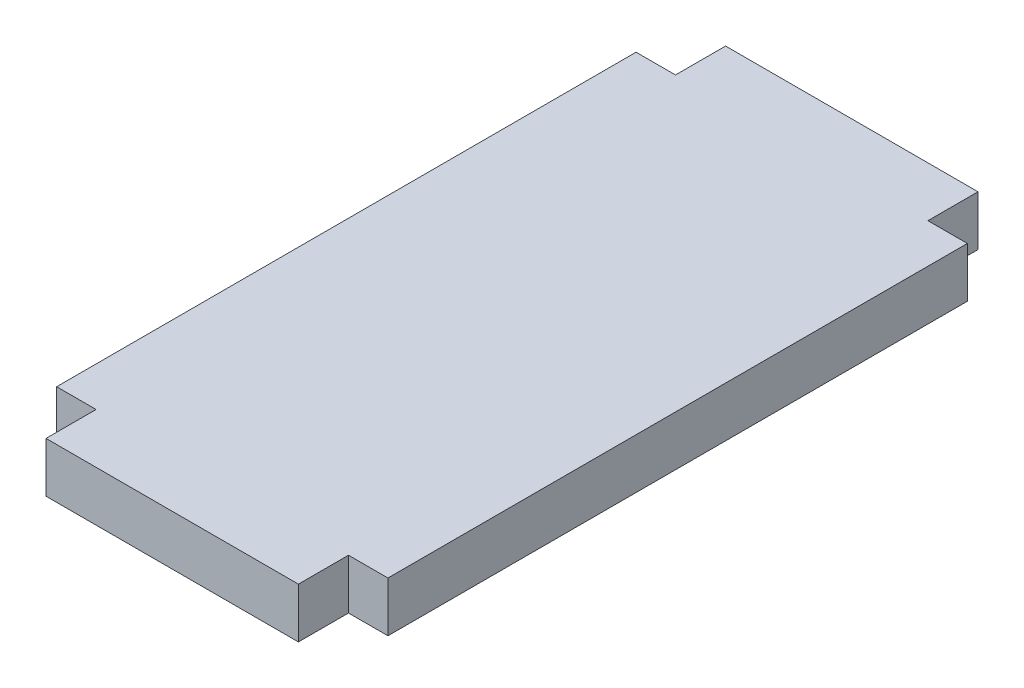
ISO-10303-21;
HEADER;
FILE_DESCRIPTION(('STEP AP214'),'2;1');
FILE_NAME('part.step','',(''),(''),'','','');
FILE_SCHEMA(('AUTOMOTIVE_DESIGN { 1 0 10303 214 1 1 1 1 }'));
ENDSEC;
DATA;
#1=APPLICATION_CONTEXT('core data for automotive mechanical design processes');
#2=APPLICATION_PROTOCOL_DEFINITION('international standard','automotive_design',2000,#1);
#3=PRODUCT_CONTEXT('',#1,'mechanical');
#4=PRODUCT('Part','Part','',(#3));
#5=PRODUCT_RELATED_PRODUCT_CATEGORY('part','',(#4));
#6=PRODUCT_DEFINITION_FORMATION('','',#4);
#7=PRODUCT_DEFINITION_CONTEXT('part definition',#1,'design');
#8=PRODUCT_DEFINITION('design','',#6,#7);
#9=PRODUCT_DEFINITION_SHAPE('','',#8);
#10=(LENGTH_UNIT() NAMED_UNIT(*) SI_UNIT(.MILLI.,.METRE.));
#11=(NAMED_UNIT(*) PLANE_ANGLE_UNIT() SI_UNIT($,.RADIAN.));
#12=(NAMED_UNIT(*) SI_UNIT($,.STERADIAN.) SOLID_ANGLE_UNIT());
#13=UNCERTAINTY_MEASURE_WITH_UNIT(LENGTH_MEASURE(1.E-05),#10,'distance_accuracy_value','');
#14=(GEOMETRIC_REPRESENTATION_CONTEXT(3) GLOBAL_UNCERTAINTY_ASSIGNED_CONTEXT((#13)) GLOBAL_UNIT_ASSIGNED_CONTEXT((#10,
#11,#12)) REPRESENTATION_CONTEXT('',''));
#15=CARTESIAN_POINT('',(0.,0.,0.));
#16=DIRECTION('',(0.,0.,1.));
#17=DIRECTION('',(1.,0.,0.));
#18=AXIS2_PLACEMENT_3D('',#15,#16,#17);
#19=CARTESIAN_POINT('',(0.,3.175,18.365));
#20=DIRECTION('',(0.,0.,-1.));
#21=DIRECTION('',(-1.,0.,0.));
#22=AXIS2_PLACEMENT_3D('',#19,#20,#21);
#23=PLANE('',#22);
#24=DIRECTION('',(1.,0.,0.));
#25=VECTOR('',#24,1.);
#26=CARTESIAN_POINT('',(0.,0.,18.365));
#27=LINE('',#26,#25);
#28=CARTESIAN_POINT('',(-10.5,0.,18.365));
#29=VERTEX_POINT('',#28);
#30=CARTESIAN_POINT('',(-8.,0.,18.365));
#31=VERTEX_POINT('',#30);
#32=EDGE_CURVE('E154',#29,#31,#27,.T.);
#33=ORIENTED_EDGE('',*,*,#32,.T.);
#34=DIRECTION('',(0.,-1.,0.));
#35=VECTOR('',#34,1.);
#36=CARTESIAN_POINT('',(-8.,3.175,18.365));
#37=LINE('',#36,#35);
#38=CARTESIAN_POINT('',(-8.,3.175,18.365));
#39=VERTEX_POINT('',#38);
#40=EDGE_CURVE('E11',#39,#31,#37,.T.);
#41=ORIENTED_EDGE('',*,*,#40,.F.);
#42=DIRECTION('',(1.,0.,0.));
#43=VECTOR('',#42,1.);
#44=CARTESIAN_POINT('',(0.,3.175,18.365));
#45=LINE('',#44,#43);
#46=CARTESIAN_POINT('',(-10.5,3.175,18.365));
#47=VERTEX_POINT('',#46);
#48=EDGE_CURVE('E184',#47,#39,#45,.T.);
#49=ORIENTED_EDGE('',*,*,#48,.F.);
#50=DIRECTION('',(0.,-1.,0.));
#51=VECTOR('',#50,1.);
#52=CARTESIAN_POINT('',(-10.5,3.175,18.365));
#53=LINE('',#52,#51);
#54=EDGE_CURVE('E150',#47,#29,#53,.T.);
#55=ORIENTED_EDGE('',*,*,#54,.T.);
#56=EDGE_LOOP('',(#33,#41,#49,#55));
#57=FACE_BOUND('',#56,.T.);
#58=ADVANCED_FACE('F35',(#57),#23,.F.);
#59=CARTESIAN_POINT('',(-8.,3.175,0.));
#60=DIRECTION('',(1.,0.,0.));
#61=DIRECTION('',(0.,0.,-1.));
#62=AXIS2_PLACEMENT_3D('',#59,#60,#61);
#63=PLANE('',#62);
#64=DIRECTION('',(0.,0.,1.));
#65=VECTOR('',#64,1.);
#66=CARTESIAN_POINT('',(-8.,0.,0.));
#67=LINE('',#66,#65);
#68=CARTESIAN_POINT('',(-8.,0.,21.54));
#69=VERTEX_POINT('',#68);
#70=EDGE_CURVE('E157',#31,#69,#67,.T.);
#71=ORIENTED_EDGE('',*,*,#70,.T.);
#72=DIRECTION('',(0.,-1.,0.));
#73=VECTOR('',#72,1.);
#74=CARTESIAN_POINT('',(-8.,3.175,21.54));
#75=LINE('',#74,#73);
#76=CARTESIAN_POINT('',(-8.,3.175,21.54));
#77=VERTEX_POINT('',#76);
#78=EDGE_CURVE('E43',#77,#69,#75,.T.);
#79=ORIENTED_EDGE('',*,*,#78,.F.);
#80=DIRECTION('',(0.,0.,1.));
#81=VECTOR('',#80,1.);
#82=CARTESIAN_POINT('',(-8.,3.175,0.));
#83=LINE('',#82,#81);
#84=EDGE_CURVE('E102',#39,#77,#83,.T.);
#85=ORIENTED_EDGE('',*,*,#84,.F.);
#86=ORIENTED_EDGE('',*,*,#40,.T.);
#87=EDGE_LOOP('',(#71,#79,#85,#86));
#88=FACE_BOUND('',#87,.T.);
#89=ADVANCED_FACE('F249',(#88),#63,.F.);
#90=CARTESIAN_POINT('',(0.,3.175,21.54));
#91=DIRECTION('',(0.,0.,-1.));
#92=DIRECTION('',(-1.,0.,0.));
#93=AXIS2_PLACEMENT_3D('',#90,#91,#92);
#94=PLANE('',#93);
#95=DIRECTION('',(1.,0.,0.));
#96=VECTOR('',#95,1.);
#97=CARTESIAN_POINT('',(0.,0.,21.54));
#98=LINE('',#97,#96);
#99=CARTESIAN_POINT('',(8.,0.,21.54));
#100=VERTEX_POINT('',#99);
#101=EDGE_CURVE('E159',#69,#100,#98,.T.);
#102=ORIENTED_EDGE('',*,*,#101,.T.);
#103=DIRECTION('',(0.,-1.,0.));
#104=VECTOR('',#103,1.);
#105=CARTESIAN_POINT('',(8.,3.175,21.54));
#106=LINE('',#105,#104);
#107=CARTESIAN_POINT('',(8.,3.175,21.54));
#108=VERTEX_POINT('',#107);
#109=EDGE_CURVE('E198',#108,#100,#106,.T.);
#110=ORIENTED_EDGE('',*,*,#109,.F.);
#111=DIRECTION('',(1.,0.,0.));
#112=VECTOR('',#111,1.);
#113=CARTESIAN_POINT('',(0.,3.175,21.54));
#114=LINE('',#113,#112);
#115=EDGE_CURVE('E205',#77,#108,#114,.T.);
#116=ORIENTED_EDGE('',*,*,#115,.F.);
#117=ORIENTED_EDGE('',*,*,#78,.T.);
#118=EDGE_LOOP('',(#102,#110,#116,#117));
#119=FACE_BOUND('',#118,.T.);
#120=ADVANCED_FACE('F203',(#119),#94,.F.);
#121=CARTESIAN_POINT('',(8.,3.175,0.));
#122=DIRECTION('',(1.,0.,0.));
#123=DIRECTION('',(0.,0.,-1.));
#124=AXIS2_PLACEMENT_3D('',#121,#122,#123);
#125=PLANE('',#124);
#126=DIRECTION('',(0.,0.,1.));
#127=VECTOR('',#126,1.);
#128=CARTESIAN_POINT('',(8.,0.,0.));
#129=LINE('',#128,#127);
#130=CARTESIAN_POINT('',(8.,0.,18.365));
#131=VERTEX_POINT('',#130);
#132=EDGE_CURVE('E162',#131,#100,#129,.T.);
#133=ORIENTED_EDGE('',*,*,#132,.F.);
#134=DIRECTION('',(0.,-1.,0.));
#135=VECTOR('',#134,1.);
#136=CARTESIAN_POINT('',(8.,3.175,18.365));
#137=LINE('',#136,#135);
#138=CARTESIAN_POINT('',(8.,3.175,18.365));
#139=VERTEX_POINT('',#138);
#140=EDGE_CURVE('E196',#139,#131,#137,.T.);
#141=ORIENTED_EDGE('',*,*,#140,.F.);
#142=DIRECTION('',(0.,0.,1.));
#143=VECTOR('',#142,1.);
#144=CARTESIAN_POINT('',(8.,3.175,0.));
#145=LINE('',#144,#143);
#146=EDGE_CURVE('E216',#139,#108,#145,.T.);
#147=ORIENTED_EDGE('',*,*,#146,.T.);
#148=ORIENTED_EDGE('',*,*,#109,.T.);
#149=EDGE_LOOP('',(#133,#141,#147,#148));
#150=FACE_BOUND('',#149,.T.);
#151=ADVANCED_FACE('F212',(#150),#125,.T.);
#152=CARTESIAN_POINT('',(0.,3.175,18.365));
#153=DIRECTION('',(0.,0.,-1.));
#154=DIRECTION('',(-1.,0.,0.));
#155=AXIS2_PLACEMENT_3D('',#152,#153,#154);
#156=PLANE('',#155);
#157=DIRECTION('',(1.,0.,0.));
#158=VECTOR('',#157,1.);
#159=CARTESIAN_POINT('',(0.,0.,18.365));
#160=LINE('',#159,#158);
#161=CARTESIAN_POINT('',(10.5,0.,18.365));
#162=VERTEX_POINT('',#161);
#163=EDGE_CURVE('E165',#131,#162,#160,.T.);
#164=ORIENTED_EDGE('',*,*,#163,.T.);
#165=DIRECTION('',(0.,-1.,0.));
#166=VECTOR('',#165,1.);
#167=CARTESIAN_POINT('',(10.5,3.175,18.365));
#168=LINE('',#167,#166);
#169=CARTESIAN_POINT('',(10.5,3.175,18.365));
#170=VERTEX_POINT('',#169);
#171=EDGE_CURVE('E194',#170,#162,#168,.T.);
#172=ORIENTED_EDGE('',*,*,#171,.F.);
#173=DIRECTION('',(1.,0.,0.));
#174=VECTOR('',#173,1.);
#175=CARTESIAN_POINT('',(0.,3.175,18.365));
#176=LINE('',#175,#174);
#177=EDGE_CURVE('E217',#139,#170,#176,.T.);
#178=ORIENTED_EDGE('',*,*,#177,.F.);
#179=ORIENTED_EDGE('',*,*,#140,.T.);
#180=EDGE_LOOP('',(#164,#172,#178,#179));
#181=FACE_BOUND('',#180,.T.);
#182=ADVANCED_FACE('F260',(#181),#156,.F.);
#183=CARTESIAN_POINT('',(10.5,3.175,0.));
#184=DIRECTION('',(1.,0.,0.));
#185=DIRECTION('',(0.,0.,-1.));
#186=AXIS2_PLACEMENT_3D('',#183,#184,#185);
#187=PLANE('',#186);
#188=DIRECTION('',(0.,0.,1.));
#189=VECTOR('',#188,1.);
#190=CARTESIAN_POINT('',(10.5,0.,0.));
#191=LINE('',#190,#189);
#192=CARTESIAN_POINT('',(10.5,0.,-18.365));
#193=VERTEX_POINT('',#192);
#194=EDGE_CURVE('E168',#193,#162,#191,.T.);
#195=ORIENTED_EDGE('',*,*,#194,.F.);
#196=DIRECTION('',(0.,-1.,0.));
#197=VECTOR('',#196,1.);
#198=CARTESIAN_POINT('',(10.5,3.175,-18.365));
#199=LINE('',#198,#197);
#200=CARTESIAN_POINT('',(10.5,3.175,-18.365));
#201=VERTEX_POINT('',#200);
#202=EDGE_CURVE('E192',#201,#193,#199,.T.);
#203=ORIENTED_EDGE('',*,*,#202,.F.);
#204=DIRECTION('',(0.,0.,1.));
#205=VECTOR('',#204,1.);
#206=CARTESIAN_POINT('',(10.5,3.175,0.));
#207=LINE('',#206,#205);
#208=EDGE_CURVE('E219',#201,#170,#207,.T.);
#209=ORIENTED_EDGE('',*,*,#208,.T.);
#210=ORIENTED_EDGE('',*,*,#171,.T.);
#211=EDGE_LOOP('',(#195,#203,#209,#210));
#212=FACE_BOUND('',#211,.T.);
#213=ADVANCED_FACE('F263',(#212),#187,.T.);
#214=CARTESIAN_POINT('',(0.,3.175,-18.365));
#215=DIRECTION('',(0.,0.,-1.));
#216=DIRECTION('',(-1.,0.,0.));
#217=AXIS2_PLACEMENT_3D('',#214,#215,#216);
#218=PLANE('',#217);
#219=DIRECTION('',(1.,0.,0.));
#220=VECTOR('',#219,1.);
#221=CARTESIAN_POINT('',(0.,0.,-18.365));
#222=LINE('',#221,#220);
#223=CARTESIAN_POINT('',(8.,0.,-18.365));
#224=VERTEX_POINT('',#223);
#225=EDGE_CURVE('E171',#224,#193,#222,.T.);
#226=ORIENTED_EDGE('',*,*,#225,.F.);
#227=DIRECTION('',(0.,-1.,0.));
#228=VECTOR('',#227,1.);
#229=CARTESIAN_POINT('',(8.,3.175,-18.365));
#230=LINE('',#229,#228);
#231=CARTESIAN_POINT('',(8.,3.175,-18.365));
#232=VERTEX_POINT('',#231);
#233=EDGE_CURVE('E190',#232,#224,#230,.T.);
#234=ORIENTED_EDGE('',*,*,#233,.F.);
#235=DIRECTION('',(1.,0.,0.));
#236=VECTOR('',#235,1.);
#237=CARTESIAN_POINT('',(0.,3.175,-18.365));
#238=LINE('',#237,#236);
#239=EDGE_CURVE('E226',#232,#201,#238,.T.);
#240=ORIENTED_EDGE('',*,*,#239,.T.);
#241=ORIENTED_EDGE('',*,*,#202,.T.);
#242=EDGE_LOOP('',(#226,#234,#240,#241));
#243=FACE_BOUND('',#242,.T.);
#244=ADVANCED_FACE('F267',(#243),#218,.T.);
#245=CARTESIAN_POINT('',(8.,3.175,0.));
#246=DIRECTION('',(1.,0.,0.));
#247=DIRECTION('',(0.,0.,-1.));
#248=AXIS2_PLACEMENT_3D('',#245,#246,#247);
#249=PLANE('',#248);
#250=DIRECTION('',(0.,0.,1.));
#251=VECTOR('',#250,1.);
#252=CARTESIAN_POINT('',(8.,0.,0.));
#253=LINE('',#252,#251);
#254=CARTESIAN_POINT('',(8.,0.,-21.54));
#255=VERTEX_POINT('',#254);
#256=EDGE_CURVE('E174',#255,#224,#253,.T.);
#257=ORIENTED_EDGE('',*,*,#256,.F.);
#258=DIRECTION('',(0.,-1.,0.));
#259=VECTOR('',#258,1.);
#260=CARTESIAN_POINT('',(8.,3.175,-21.54));
#261=LINE('',#260,#259);
#262=CARTESIAN_POINT('',(8.,3.175,-21.54));
#263=VERTEX_POINT('',#262);
#264=EDGE_CURVE('E188',#263,#255,#261,.T.);
#265=ORIENTED_EDGE('',*,*,#264,.F.);
#266=DIRECTION('',(0.,0.,1.));
#267=VECTOR('',#266,1.);
#268=CARTESIAN_POINT('',(8.,3.175,0.));
#269=LINE('',#268,#267);
#270=EDGE_CURVE('E229',#263,#232,#269,.T.);
#271=ORIENTED_EDGE('',*,*,#270,.T.);
#272=ORIENTED_EDGE('',*,*,#233,.T.);
#273=EDGE_LOOP('',(#257,#265,#271,#272));
#274=FACE_BOUND('',#273,.T.);
#275=ADVANCED_FACE('F271',(#274),#249,.T.);
#276=CARTESIAN_POINT('',(0.,3.175,-21.54));
#277=DIRECTION('',(0.,0.,-1.));
#278=DIRECTION('',(-1.,0.,0.));
#279=AXIS2_PLACEMENT_3D('',#276,#277,#278);
#280=PLANE('',#279);
#281=DIRECTION('',(1.,0.,0.));
#282=VECTOR('',#281,1.);
#283=CARTESIAN_POINT('',(0.,0.,-21.54));
#284=LINE('',#283,#282);
#285=CARTESIAN_POINT('',(-8.,0.,-21.54));
#286=VERTEX_POINT('',#285);
#287=EDGE_CURVE('E177',#286,#255,#284,.T.);
#288=ORIENTED_EDGE('',*,*,#287,.F.);
#289=DIRECTION('',(0.,-1.,0.));
#290=VECTOR('',#289,1.);
#291=CARTESIAN_POINT('',(-8.,3.175,-21.54));
#292=LINE('',#291,#290);
#293=CARTESIAN_POINT('',(-8.,3.175,-21.54));
#294=VERTEX_POINT('',#293);
#295=EDGE_CURVE('E146',#294,#286,#292,.T.);
#296=ORIENTED_EDGE('',*,*,#295,.F.);
#297=DIRECTION('',(1.,0.,0.));
#298=VECTOR('',#297,1.);
#299=CARTESIAN_POINT('',(0.,3.175,-21.54));
#300=LINE('',#299,#298);
#301=EDGE_CURVE('E135',#294,#263,#300,.T.);
#302=ORIENTED_EDGE('',*,*,#301,.T.);
#303=ORIENTED_EDGE('',*,*,#264,.T.);
#304=EDGE_LOOP('',(#288,#296,#302,#303));
#305=FACE_BOUND('',#304,.T.);
#306=ADVANCED_FACE('F233',(#305),#280,.T.);
#307=CARTESIAN_POINT('',(-8.,3.175,0.));
#308=DIRECTION('',(1.,0.,0.));
#309=DIRECTION('',(0.,0.,-1.));
#310=AXIS2_PLACEMENT_3D('',#307,#308,#309);
#311=PLANE('',#310);
#312=DIRECTION('',(0.,0.,1.));
#313=VECTOR('',#312,1.);
#314=CARTESIAN_POINT('',(-8.,0.,0.));
#315=LINE('',#314,#313);
#316=CARTESIAN_POINT('',(-8.,0.,-18.365));
#317=VERTEX_POINT('',#316);
#318=EDGE_CURVE('E142',#286,#317,#315,.T.);
#319=ORIENTED_EDGE('',*,*,#318,.T.);
#320=DIRECTION('',(0.,-1.,0.));
#321=VECTOR('',#320,1.);
#322=CARTESIAN_POINT('',(-8.,3.175,-18.365));
#323=LINE('',#322,#321);
#324=CARTESIAN_POINT('',(-8.,3.175,-18.365));
#325=VERTEX_POINT('',#324);
#326=EDGE_CURVE('E139',#325,#317,#323,.T.);
#327=ORIENTED_EDGE('',*,*,#326,.F.);
#328=DIRECTION('',(0.,0.,1.));
#329=VECTOR('',#328,1.);
#330=CARTESIAN_POINT('',(-8.,3.175,0.));
#331=LINE('',#330,#329);
#332=EDGE_CURVE('E128',#294,#325,#331,.T.);
#333=ORIENTED_EDGE('',*,*,#332,.F.);
#334=ORIENTED_EDGE('',*,*,#295,.T.);
#335=EDGE_LOOP('',(#319,#327,#333,#334));
#336=FACE_BOUND('',#335,.T.);
#337=ADVANCED_FACE('F140',(#336),#311,.F.);
#338=CARTESIAN_POINT('',(0.,3.175,-18.365));
#339=DIRECTION('',(0.,0.,-1.));
#340=DIRECTION('',(-1.,0.,0.));
#341=AXIS2_PLACEMENT_3D('',#338,#339,#340);
#342=PLANE('',#341);
#343=DIRECTION('',(1.,0.,0.));
#344=VECTOR('',#343,1.);
#345=CARTESIAN_POINT('',(0.,0.,-18.365));
#346=LINE('',#345,#344);
#347=CARTESIAN_POINT('',(-10.5,0.,-18.365));
#348=VERTEX_POINT('',#347);
#349=EDGE_CURVE('E181',#348,#317,#346,.T.);
#350=ORIENTED_EDGE('',*,*,#349,.F.);
#351=DIRECTION('',(0.,-1.,0.));
#352=VECTOR('',#351,1.);
#353=CARTESIAN_POINT('',(-10.5,3.175,-18.365));
#354=LINE('',#353,#352);
#355=CARTESIAN_POINT('',(-10.5,3.175,-18.365));
#356=VERTEX_POINT('',#355);
#357=EDGE_CURVE('E91',#356,#348,#354,.T.);
#358=ORIENTED_EDGE('',*,*,#357,.F.);
#359=DIRECTION('',(1.,0.,0.));
#360=VECTOR('',#359,1.);
#361=CARTESIAN_POINT('',(0.,3.175,-18.365));
#362=LINE('',#361,#360);
#363=EDGE_CURVE('E132',#356,#325,#362,.T.);
#364=ORIENTED_EDGE('',*,*,#363,.T.);
#365=ORIENTED_EDGE('',*,*,#326,.T.);
#366=EDGE_LOOP('',(#350,#358,#364,#365));
#367=FACE_BOUND('',#366,.T.);
#368=ADVANCED_FACE('F148',(#367),#342,.T.);
#369=CARTESIAN_POINT('',(-10.5,3.175,0.));
#370=DIRECTION('',(1.,0.,0.));
#371=DIRECTION('',(0.,0.,-1.));
#372=AXIS2_PLACEMENT_3D('',#369,#370,#371);
#373=PLANE('',#372);
#374=DIRECTION('',(0.,0.,1.));
#375=VECTOR('',#374,1.);
#376=CARTESIAN_POINT('',(-10.5,0.,0.));
#377=LINE('',#376,#375);
#378=EDGE_CURVE('E94',#348,#29,#377,.T.);
#379=ORIENTED_EDGE('',*,*,#378,.T.);
#380=ORIENTED_EDGE('',*,*,#54,.F.);
#381=DIRECTION('',(0.,0.,1.));
#382=VECTOR('',#381,1.);
#383=CARTESIAN_POINT('',(-10.5,3.175,0.));
#384=LINE('',#383,#382);
#385=EDGE_CURVE('E51',#356,#47,#384,.T.);
#386=ORIENTED_EDGE('',*,*,#385,.F.);
#387=ORIENTED_EDGE('',*,*,#357,.T.);
#388=EDGE_LOOP('',(#379,#380,#386,#387));
#389=FACE_BOUND('',#388,.T.);
#390=ADVANCED_FACE('F238',(#389),#373,.F.);
#391=CARTESIAN_POINT('',(0.,3.175,0.));
#392=DIRECTION('',(0.,1.,0.));
#393=DIRECTION('',(0.,0.,1.));
#394=AXIS2_PLACEMENT_3D('',#391,#392,#393);
#395=PLANE('',#394);
#396=ORIENTED_EDGE('',*,*,#48,.T.);
#397=ORIENTED_EDGE('',*,*,#84,.T.);
#398=ORIENTED_EDGE('',*,*,#115,.T.);
#399=ORIENTED_EDGE('',*,*,#146,.F.);
#400=ORIENTED_EDGE('',*,*,#177,.T.);
#401=ORIENTED_EDGE('',*,*,#208,.F.);
#402=ORIENTED_EDGE('',*,*,#239,.F.);
#403=ORIENTED_EDGE('',*,*,#270,.F.);
#404=ORIENTED_EDGE('',*,*,#301,.F.);
#405=ORIENTED_EDGE('',*,*,#332,.T.);
#406=ORIENTED_EDGE('',*,*,#363,.F.);
#407=ORIENTED_EDGE('',*,*,#385,.T.);
#408=EDGE_LOOP('',(#396,#397,#398,#399,#400,#401,#402,#403,#404,#405,#406,#407));
#409=FACE_BOUND('',#408,.T.);
#410=ADVANCED_FACE('F130',(#409),#395,.T.);
#411=CARTESIAN_POINT('',(0.,0.,0.));
#412=DIRECTION('',(0.,1.,0.));
#413=DIRECTION('',(0.,0.,1.));
#414=AXIS2_PLACEMENT_3D('',#411,#412,#413);
#415=PLANE('',#414);
#416=ORIENTED_EDGE('',*,*,#32,.F.);
#417=ORIENTED_EDGE('',*,*,#378,.F.);
#418=ORIENTED_EDGE('',*,*,#349,.T.);
#419=ORIENTED_EDGE('',*,*,#318,.F.);
#420=ORIENTED_EDGE('',*,*,#287,.T.);
#421=ORIENTED_EDGE('',*,*,#256,.T.);
#422=ORIENTED_EDGE('',*,*,#225,.T.);
#423=ORIENTED_EDGE('',*,*,#194,.T.);
#424=ORIENTED_EDGE('',*,*,#163,.F.);
#425=ORIENTED_EDGE('',*,*,#132,.T.);
#426=ORIENTED_EDGE('',*,*,#101,.F.);
#427=ORIENTED_EDGE('',*,*,#70,.F.);
#428=EDGE_LOOP('',(#416,#417,#418,#419,#420,#421,#422,#423,#424,#425,#426,#427));
#429=FACE_BOUND('',#428,.T.);
#430=ADVANCED_FACE('F208',(#429),#415,.F.);
#431=CLOSED_SHELL('',(#58,#89,#120,#151,#182,#213,#244,#275,#306,#337,#368,#390,#410,#430));
#432=MANIFOLD_SOLID_BREP('B2',#431);
#433=ADVANCED_BREP_SHAPE_REPRESENTATION('',(#18,#432),#14);
#434=SHAPE_DEFINITION_REPRESENTATION(#9,#433);
ENDSEC;
END-ISO-10303-21;
